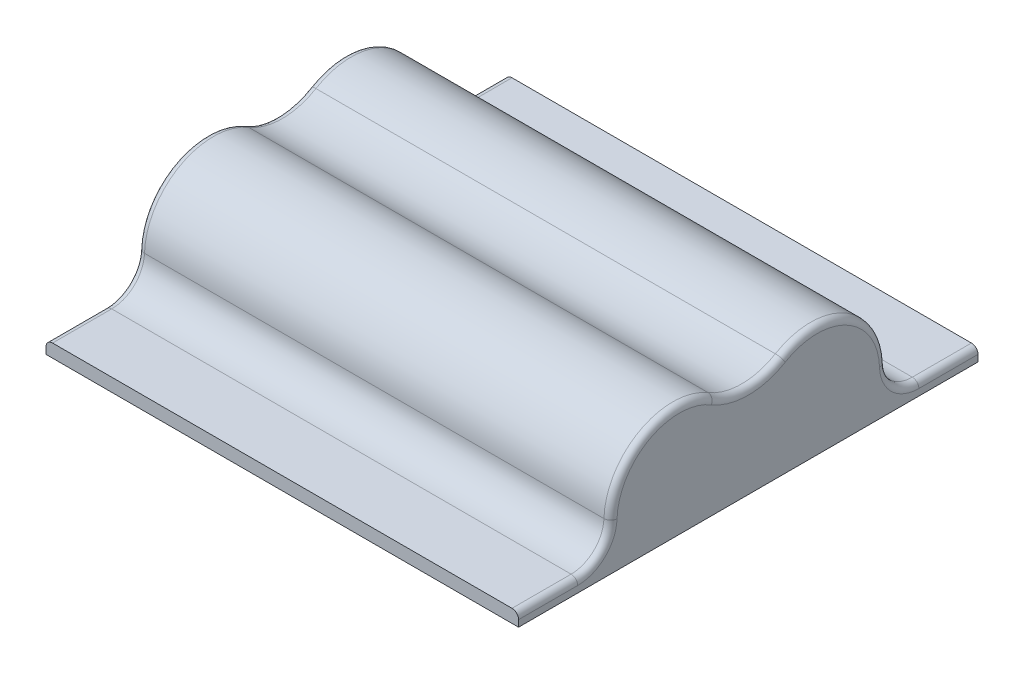
ISO-10303-21;
HEADER;
FILE_DESCRIPTION(('STEP AP214'),'2;1');
FILE_NAME('part.step','',(''),(''),'','','');
FILE_SCHEMA(('AUTOMOTIVE_DESIGN { 1 0 10303 214 1 1 1 1 }'));
ENDSEC;
DATA;
#1=APPLICATION_CONTEXT('core data for automotive mechanical design processes');
#2=APPLICATION_PROTOCOL_DEFINITION('international standard','automotive_design',2000,#1);
#3=PRODUCT_CONTEXT('',#1,'mechanical');
#4=PRODUCT('Part','Part','',(#3));
#5=PRODUCT_RELATED_PRODUCT_CATEGORY('part','',(#4));
#6=PRODUCT_DEFINITION_FORMATION('','',#4);
#7=PRODUCT_DEFINITION_CONTEXT('part definition',#1,'design');
#8=PRODUCT_DEFINITION('design','',#6,#7);
#9=PRODUCT_DEFINITION_SHAPE('','',#8);
#10=(LENGTH_UNIT() NAMED_UNIT(*) SI_UNIT(.MILLI.,.METRE.));
#11=(NAMED_UNIT(*) PLANE_ANGLE_UNIT() SI_UNIT($,.RADIAN.));
#12=(NAMED_UNIT(*) SI_UNIT($,.STERADIAN.) SOLID_ANGLE_UNIT());
#13=UNCERTAINTY_MEASURE_WITH_UNIT(LENGTH_MEASURE(1.E-05),#10,'distance_accuracy_value','');
#14=(GEOMETRIC_REPRESENTATION_CONTEXT(3) GLOBAL_UNCERTAINTY_ASSIGNED_CONTEXT((#13)) GLOBAL_UNIT_ASSIGNED_CONTEXT((#10,
#11,#12)) REPRESENTATION_CONTEXT('',''));
#15=CARTESIAN_POINT('',(0.,0.,0.));
#16=DIRECTION('',(0.,0.,1.));
#17=DIRECTION('',(1.,0.,0.));
#18=AXIS2_PLACEMENT_3D('',#15,#16,#17);
#19=CARTESIAN_POINT('',(0.,2.,0.));
#20=DIRECTION('',(0.,-1.,0.));
#21=DIRECTION('',(0.,0.,-1.));
#22=AXIS2_PLACEMENT_3D('',#19,#20,#21);
#23=PLANE('',#22);
#24=DIRECTION('',(-1.,0.,0.));
#25=VECTOR('',#24,1.);
#26=CARTESIAN_POINT('',(-36.,2.,-35.));
#27=LINE('',#26,#25);
#28=CARTESIAN_POINT('',(35.,2.,-35.));
#29=VERTEX_POINT('',#28);
#30=CARTESIAN_POINT('',(-35.,2.,-35.));
#31=VERTEX_POINT('',#30);
#32=EDGE_CURVE('E270',#29,#31,#27,.T.);
#33=ORIENTED_EDGE('',*,*,#32,.T.);
#34=DIRECTION('',(0.,0.,1.));
#35=VECTOR('',#34,1.);
#36=CARTESIAN_POINT('',(-35.,2.,0.));
#37=LINE('',#36,#35);
#38=CARTESIAN_POINT('',(-35.,2.,-25.9919333848297));
#39=VERTEX_POINT('',#38);
#40=EDGE_CURVE('E332',#31,#39,#37,.T.);
#41=ORIENTED_EDGE('',*,*,#40,.T.);
#42=DIRECTION('',(1.,0.,0.));
#43=VECTOR('',#42,1.);
#44=CARTESIAN_POINT('',(-34.,2.,-25.9919333848297));
#45=LINE('',#44,#43);
#46=CARTESIAN_POINT('',(35.,2.,-25.9919333848297));
#47=VERTEX_POINT('',#46);
#48=EDGE_CURVE('E254',#39,#47,#45,.T.);
#49=ORIENTED_EDGE('',*,*,#48,.T.);
#50=DIRECTION('',(0.,0.,-1.));
#51=VECTOR('',#50,1.);
#52=CARTESIAN_POINT('',(35.,2.,0.));
#53=LINE('',#52,#51);
#54=EDGE_CURVE('E295',#47,#29,#53,.T.);
#55=ORIENTED_EDGE('',*,*,#54,.T.);
#56=EDGE_LOOP('',(#33,#41,#49,#55));
#57=FACE_BOUND('',#56,.T.);
#58=ADVANCED_FACE('F33',(#57),#23,.F.);
#59=DIRECTION('',(1.,0.,0.));
#60=VECTOR('',#59,1.);
#61=CARTESIAN_POINT('',(-34.,2.,25.9919333848297));
#62=LINE('',#61,#60);
#63=CARTESIAN_POINT('',(-35.,2.,25.9919333848297));
#64=VERTEX_POINT('',#63);
#65=CARTESIAN_POINT('',(35.,2.,25.9919333848297));
#66=VERTEX_POINT('',#65);
#67=EDGE_CURVE('E263',#64,#66,#62,.T.);
#68=ORIENTED_EDGE('',*,*,#67,.F.);
#69=DIRECTION('',(0.,0.,1.));
#70=VECTOR('',#69,1.);
#71=CARTESIAN_POINT('',(-35.,2.,0.));
#72=LINE('',#71,#70);
#73=CARTESIAN_POINT('',(-35.,2.,35.));
#74=VERTEX_POINT('',#73);
#75=EDGE_CURVE('E56',#64,#74,#72,.T.);
#76=ORIENTED_EDGE('',*,*,#75,.T.);
#77=DIRECTION('',(1.,0.,0.));
#78=VECTOR('',#77,1.);
#79=CARTESIAN_POINT('',(-36.,2.,35.));
#80=LINE('',#79,#78);
#81=CARTESIAN_POINT('',(35.,2.,35.));
#82=VERTEX_POINT('',#81);
#83=EDGE_CURVE('E268',#74,#82,#80,.T.);
#84=ORIENTED_EDGE('',*,*,#83,.T.);
#85=DIRECTION('',(0.,0.,-1.));
#86=VECTOR('',#85,1.);
#87=CARTESIAN_POINT('',(35.,2.,0.));
#88=LINE('',#87,#86);
#89=EDGE_CURVE('E292',#82,#66,#88,.T.);
#90=ORIENTED_EDGE('',*,*,#89,.T.);
#91=EDGE_LOOP('',(#68,#76,#84,#90));
#92=FACE_BOUND('',#91,.T.);
#93=ADVANCED_FACE('F422',(#92),#23,.F.);
#94=CARTESIAN_POINT('',(0.,0.,0.));
#95=DIRECTION('',(0.,-1.,0.));
#96=DIRECTION('',(0.,0.,-1.));
#97=AXIS2_PLACEMENT_3D('',#94,#95,#96);
#98=PLANE('',#97);
#99=DIRECTION('',(0.,0.,1.));
#100=VECTOR('',#99,1.);
#101=CARTESIAN_POINT('',(-36.,0.,35.));
#102=LINE('',#101,#100);
#103=CARTESIAN_POINT('',(-36.,0.,-35.));
#104=VERTEX_POINT('',#103);
#105=CARTESIAN_POINT('',(-36.,0.,35.));
#106=VERTEX_POINT('',#105);
#107=EDGE_CURVE('E251',#104,#106,#102,.T.);
#108=ORIENTED_EDGE('',*,*,#107,.F.);
#109=DIRECTION('',(-1.,0.,0.));
#110=VECTOR('',#109,1.);
#111=CARTESIAN_POINT('',(-36.,0.,-35.));
#112=LINE('',#111,#110);
#113=CARTESIAN_POINT('',(36.,0.,-35.));
#114=VERTEX_POINT('',#113);
#115=EDGE_CURVE('E271',#114,#104,#112,.T.);
#116=ORIENTED_EDGE('',*,*,#115,.F.);
#117=DIRECTION('',(0.,0.,-1.));
#118=VECTOR('',#117,1.);
#119=CARTESIAN_POINT('',(36.,0.,35.));
#120=LINE('',#119,#118);
#121=CARTESIAN_POINT('',(36.,0.,35.));
#122=VERTEX_POINT('',#121);
#123=EDGE_CURVE('E280',#122,#114,#120,.T.);
#124=ORIENTED_EDGE('',*,*,#123,.F.);
#125=DIRECTION('',(1.,0.,0.));
#126=VECTOR('',#125,1.);
#127=CARTESIAN_POINT('',(-36.,0.,35.));
#128=LINE('',#127,#126);
#129=EDGE_CURVE('E277',#106,#122,#128,.T.);
#130=ORIENTED_EDGE('',*,*,#129,.F.);
#131=EDGE_LOOP('',(#108,#116,#124,#130));
#132=FACE_BOUND('',#131,.T.);
#133=DIRECTION('',(1.,0.,0.));
#134=VECTOR('',#133,1.);
#135=CARTESIAN_POINT('',(-73.5506005011302,0.,-19.75));
#136=LINE('',#135,#134);
#137=CARTESIAN_POINT('',(-34.,0.,-19.75));
#138=VERTEX_POINT('',#137);
#139=CARTESIAN_POINT('',(34.,0.,-19.75));
#140=VERTEX_POINT('',#139);
#141=EDGE_CURVE('E223',#138,#140,#136,.T.);
#142=ORIENTED_EDGE('',*,*,#141,.F.);
#143=DIRECTION('',(0.,0.,1.));
#144=VECTOR('',#143,1.);
#145=CARTESIAN_POINT('',(-34.,0.,-19.75));
#146=LINE('',#145,#144);
#147=CARTESIAN_POINT('',(-34.,0.,19.75));
#148=VERTEX_POINT('',#147);
#149=EDGE_CURVE('E208',#138,#148,#146,.T.);
#150=ORIENTED_EDGE('',*,*,#149,.T.);
#151=DIRECTION('',(1.,0.,0.));
#152=VECTOR('',#151,1.);
#153=CARTESIAN_POINT('',(-73.5506005011302,0.,19.75));
#154=LINE('',#153,#152);
#155=CARTESIAN_POINT('',(34.,0.,19.75));
#156=VERTEX_POINT('',#155);
#157=EDGE_CURVE('E201',#148,#156,#154,.T.);
#158=ORIENTED_EDGE('',*,*,#157,.T.);
#159=DIRECTION('',(0.,0.,-1.));
#160=VECTOR('',#159,1.);
#161=CARTESIAN_POINT('',(34.,0.,-19.75));
#162=LINE('',#161,#160);
#163=EDGE_CURVE('E211',#156,#140,#162,.T.);
#164=ORIENTED_EDGE('',*,*,#163,.T.);
#165=EDGE_LOOP('',(#142,#150,#158,#164));
#166=FACE_BOUND('',#165,.T.);
#167=ADVANCED_FACE('F221',(#132,#166),#98,.T.);
#168=CARTESIAN_POINT('',(-36.,2.,35.));
#169=DIRECTION('',(1.,0.,0.));
#170=DIRECTION('',(0.,0.,-1.));
#171=AXIS2_PLACEMENT_3D('',#168,#169,#170);
#172=PLANE('',#171);
#173=CARTESIAN_POINT('',(-36.,7.,-25.9919333848297));
#174=DIRECTION('',(1.,0.,0.));
#175=DIRECTION('',(0.,0.,-1.));
#176=AXIS2_PLACEMENT_3D('',#173,#174,#175);
#177=CIRCLE('',#176,6.);
#178=CARTESIAN_POINT('',(-36.,6.80645161290323,-19.9950559455408));
#179=VERTEX_POINT('',#178);
#180=CARTESIAN_POINT('',(-36.,0.999999999999999,-25.9919333848297));
#181=VERTEX_POINT('',#180);
#182=EDGE_CURVE('E362',#179,#181,#177,.T.);
#183=ORIENTED_EDGE('',*,*,#182,.T.);
#184=DIRECTION('',(0.,0.,1.));
#185=VECTOR('',#184,1.);
#186=CARTESIAN_POINT('',(-36.,1.,35.));
#187=LINE('',#186,#185);
#188=CARTESIAN_POINT('',(-36.,1.,-35.));
#189=VERTEX_POINT('',#188);
#190=EDGE_CURVE('E364',#181,#189,#187,.F.);
#191=ORIENTED_EDGE('',*,*,#190,.T.);
#192=DIRECTION('',(0.,-1.,0.));
#193=VECTOR('',#192,1.);
#194=CARTESIAN_POINT('',(-36.,2.,-35.));
#195=LINE('',#194,#193);
#196=EDGE_CURVE('E274',#189,#104,#195,.T.);
#197=ORIENTED_EDGE('',*,*,#196,.T.);
#198=ORIENTED_EDGE('',*,*,#107,.T.);
#199=DIRECTION('',(0.,-1.,0.));
#200=VECTOR('',#199,1.);
#201=CARTESIAN_POINT('',(-36.,2.,35.));
#202=LINE('',#201,#200);
#203=CARTESIAN_POINT('',(-36.,1.,35.));
#204=VERTEX_POINT('',#203);
#205=EDGE_CURVE('E290',#204,#106,#202,.T.);
#206=ORIENTED_EDGE('',*,*,#205,.F.);
#207=DIRECTION('',(0.,0.,1.));
#208=VECTOR('',#207,1.);
#209=CARTESIAN_POINT('',(-36.,1.,35.));
#210=LINE('',#209,#208);
#211=CARTESIAN_POINT('',(-36.,0.999999999999999,25.9919333848297));
#212=VERTEX_POINT('',#211);
#213=EDGE_CURVE('E356',#204,#212,#210,.F.);
#214=ORIENTED_EDGE('',*,*,#213,.T.);
#215=CARTESIAN_POINT('',(-36.,7.,25.9919333848297));
#216=DIRECTION('',(1.,0.,0.));
#217=DIRECTION('',(0.,0.,-1.));
#218=AXIS2_PLACEMENT_3D('',#215,#216,#217);
#219=CIRCLE('',#218,6.);
#220=CARTESIAN_POINT('',(-36.,6.80645161290323,19.9950559455408));
#221=VERTEX_POINT('',#220);
#222=EDGE_CURVE('E354',#212,#221,#219,.T.);
#223=ORIENTED_EDGE('',*,*,#222,.T.);
#224=CARTESIAN_POINT('',(-36.,6.5,10.5));
#225=DIRECTION('',(1.,0.,0.));
#226=DIRECTION('',(0.,0.,-1.));
#227=AXIS2_PLACEMENT_3D('',#224,#225,#226);
#228=CIRCLE('',#227,9.5);
#229=CARTESIAN_POINT('',(-36.,14.6592565944273,5.63414634146342));
#230=VERTEX_POINT('',#229);
#231=EDGE_CURVE('E352',#221,#230,#228,.F.);
#232=ORIENTED_EDGE('',*,*,#231,.T.);
#233=CARTESIAN_POINT('',(-36.,24.106816861659,0.));
#234=DIRECTION('',(1.,0.,0.));
#235=DIRECTION('',(0.,0.,-1.));
#236=AXIS2_PLACEMENT_3D('',#233,#234,#235);
#237=CIRCLE('',#236,11.);
#238=CARTESIAN_POINT('',(-36.,14.6592565944273,-5.63414634146342));
#239=VERTEX_POINT('',#238);
#240=EDGE_CURVE('E358',#230,#239,#237,.T.);
#241=ORIENTED_EDGE('',*,*,#240,.T.);
#242=CARTESIAN_POINT('',(-36.,6.5,-10.5));
#243=DIRECTION('',(1.,0.,0.));
#244=DIRECTION('',(0.,0.,-1.));
#245=AXIS2_PLACEMENT_3D('',#242,#243,#244);
#246=CIRCLE('',#245,9.5);
#247=EDGE_CURVE('E360',#239,#179,#246,.F.);
#248=ORIENTED_EDGE('',*,*,#247,.T.);
#249=EDGE_LOOP('',(#183,#191,#197,#198,#206,#214,#223,#232,#241,#248));
#250=FACE_BOUND('',#249,.T.);
#251=ADVANCED_FACE('F407',(#250),#172,.F.);
#252=CARTESIAN_POINT('',(-36.,2.,35.));
#253=DIRECTION('',(0.,0.,-1.));
#254=DIRECTION('',(-1.,0.,0.));
#255=AXIS2_PLACEMENT_3D('',#252,#253,#254);
#256=PLANE('',#255);
#257=ORIENTED_EDGE('',*,*,#83,.F.);
#258=CARTESIAN_POINT('',(-35.,1.,35.));
#259=DIRECTION('',(0.,0.,-1.));
#260=DIRECTION('',(-1.,0.,0.));
#261=AXIS2_PLACEMENT_3D('',#258,#259,#260);
#262=CIRCLE('',#261,1.);
#263=EDGE_CURVE('E375',#74,#204,#262,.F.);
#264=ORIENTED_EDGE('',*,*,#263,.T.);
#265=ORIENTED_EDGE('',*,*,#205,.T.);
#266=ORIENTED_EDGE('',*,*,#129,.T.);
#267=DIRECTION('',(0.,-1.,0.));
#268=VECTOR('',#267,1.);
#269=CARTESIAN_POINT('',(36.,2.,35.));
#270=LINE('',#269,#268);
#271=CARTESIAN_POINT('',(36.,1.,35.));
#272=VERTEX_POINT('',#271);
#273=EDGE_CURVE('E288',#272,#122,#270,.T.);
#274=ORIENTED_EDGE('',*,*,#273,.F.);
#275=CARTESIAN_POINT('',(35.,1.,35.));
#276=DIRECTION('',(0.,0.,-1.));
#277=DIRECTION('',(-1.,0.,0.));
#278=AXIS2_PLACEMENT_3D('',#275,#276,#277);
#279=CIRCLE('',#278,1.);
#280=EDGE_CURVE('E323',#272,#82,#279,.F.);
#281=ORIENTED_EDGE('',*,*,#280,.T.);
#282=EDGE_LOOP('',(#257,#264,#265,#266,#274,#281));
#283=FACE_BOUND('',#282,.T.);
#284=ADVANCED_FACE('F404',(#283),#256,.F.);
#285=CARTESIAN_POINT('',(36.,2.,35.));
#286=DIRECTION('',(-1.,0.,0.));
#287=DIRECTION('',(0.,0.,1.));
#288=AXIS2_PLACEMENT_3D('',#285,#286,#287);
#289=PLANE('',#288);
#290=DIRECTION('',(0.,-1.,0.));
#291=VECTOR('',#290,1.);
#292=CARTESIAN_POINT('',(36.,2.,-35.));
#293=LINE('',#292,#291);
#294=CARTESIAN_POINT('',(36.,1.,-35.));
#295=VERTEX_POINT('',#294);
#296=EDGE_CURVE('E286',#295,#114,#293,.T.);
#297=ORIENTED_EDGE('',*,*,#296,.F.);
#298=DIRECTION('',(0.,0.,-1.));
#299=VECTOR('',#298,1.);
#300=CARTESIAN_POINT('',(36.,1.,35.));
#301=LINE('',#300,#299);
#302=CARTESIAN_POINT('',(36.,0.999999999999999,-25.9919333848297));
#303=VERTEX_POINT('',#302);
#304=EDGE_CURVE('E312',#295,#303,#301,.F.);
#305=ORIENTED_EDGE('',*,*,#304,.T.);
#306=CARTESIAN_POINT('',(36.,7.,-25.9919333848297));
#307=DIRECTION('',(-1.,0.,0.));
#308=DIRECTION('',(0.,0.,1.));
#309=AXIS2_PLACEMENT_3D('',#306,#307,#308);
#310=CIRCLE('',#309,6.);
#311=CARTESIAN_POINT('',(36.,6.80645161290323,-19.9950559455408));
#312=VERTEX_POINT('',#311);
#313=EDGE_CURVE('E310',#303,#312,#310,.T.);
#314=ORIENTED_EDGE('',*,*,#313,.T.);
#315=CARTESIAN_POINT('',(36.,6.5,-10.5));
#316=DIRECTION('',(-1.,0.,0.));
#317=DIRECTION('',(0.,0.,1.));
#318=AXIS2_PLACEMENT_3D('',#315,#316,#317);
#319=CIRCLE('',#318,9.5);
#320=CARTESIAN_POINT('',(36.,14.6592565944273,-5.63414634146342));
#321=VERTEX_POINT('',#320);
#322=EDGE_CURVE('E308',#312,#321,#319,.F.);
#323=ORIENTED_EDGE('',*,*,#322,.T.);
#324=CARTESIAN_POINT('',(36.,24.106816861659,0.));
#325=DIRECTION('',(-1.,0.,0.));
#326=DIRECTION('',(0.,0.,1.));
#327=AXIS2_PLACEMENT_3D('',#324,#325,#326);
#328=CIRCLE('',#327,11.);
#329=CARTESIAN_POINT('',(36.,14.6592565944273,5.63414634146341));
#330=VERTEX_POINT('',#329);
#331=EDGE_CURVE('E306',#321,#330,#328,.T.);
#332=ORIENTED_EDGE('',*,*,#331,.T.);
#333=CARTESIAN_POINT('',(36.,6.5,10.5));
#334=DIRECTION('',(-1.,0.,0.));
#335=DIRECTION('',(0.,0.,1.));
#336=AXIS2_PLACEMENT_3D('',#333,#334,#335);
#337=CIRCLE('',#336,9.5);
#338=CARTESIAN_POINT('',(36.,6.80645161290323,19.9950559455408));
#339=VERTEX_POINT('',#338);
#340=EDGE_CURVE('E300',#330,#339,#337,.F.);
#341=ORIENTED_EDGE('',*,*,#340,.T.);
#342=CARTESIAN_POINT('',(36.,7.,25.9919333848297));
#343=DIRECTION('',(-1.,0.,0.));
#344=DIRECTION('',(0.,0.,1.));
#345=AXIS2_PLACEMENT_3D('',#342,#343,#344);
#346=CIRCLE('',#345,6.);
#347=CARTESIAN_POINT('',(36.,0.999999999999999,25.9919333848297));
#348=VERTEX_POINT('',#347);
#349=EDGE_CURVE('E302',#339,#348,#346,.T.);
#350=ORIENTED_EDGE('',*,*,#349,.T.);
#351=DIRECTION('',(0.,0.,-1.));
#352=VECTOR('',#351,1.);
#353=CARTESIAN_POINT('',(36.,1.,35.));
#354=LINE('',#353,#352);
#355=EDGE_CURVE('E304',#348,#272,#354,.F.);
#356=ORIENTED_EDGE('',*,*,#355,.T.);
#357=ORIENTED_EDGE('',*,*,#273,.T.);
#358=ORIENTED_EDGE('',*,*,#123,.T.);
#359=EDGE_LOOP('',(#297,#305,#314,#323,#332,#341,#350,#356,#357,#358));
#360=FACE_BOUND('',#359,.T.);
#361=ADVANCED_FACE('F476',(#360),#289,.F.);
#362=CARTESIAN_POINT('',(-36.,2.,-35.));
#363=DIRECTION('',(0.,0.,1.));
#364=DIRECTION('',(1.,0.,0.));
#365=AXIS2_PLACEMENT_3D('',#362,#363,#364);
#366=PLANE('',#365);
#367=ORIENTED_EDGE('',*,*,#196,.F.);
#368=CARTESIAN_POINT('',(-35.,1.,-35.));
#369=DIRECTION('',(0.,0.,1.));
#370=DIRECTION('',(1.,0.,0.));
#371=AXIS2_PLACEMENT_3D('',#368,#369,#370);
#372=CIRCLE('',#371,1.);
#373=EDGE_CURVE('E366',#189,#31,#372,.F.);
#374=ORIENTED_EDGE('',*,*,#373,.T.);
#375=ORIENTED_EDGE('',*,*,#32,.F.);
#376=CARTESIAN_POINT('',(35.,1.,-35.));
#377=DIRECTION('',(0.,0.,1.));
#378=DIRECTION('',(1.,0.,0.));
#379=AXIS2_PLACEMENT_3D('',#376,#377,#378);
#380=CIRCLE('',#379,1.);
#381=EDGE_CURVE('E298',#29,#295,#380,.F.);
#382=ORIENTED_EDGE('',*,*,#381,.T.);
#383=ORIENTED_EDGE('',*,*,#296,.T.);
#384=ORIENTED_EDGE('',*,*,#115,.T.);
#385=EDGE_LOOP('',(#367,#374,#375,#382,#383,#384));
#386=FACE_BOUND('',#385,.T.);
#387=ADVANCED_FACE('F473',(#386),#366,.F.);
#388=CARTESIAN_POINT('',(-34.,24.106816861659,0.));
#389=DIRECTION('',(1.,0.,0.));
#390=DIRECTION('',(0.,0.,-1.));
#391=AXIS2_PLACEMENT_3D('',#388,#389,#390);
#392=CYLINDRICAL_SURFACE('',#391,10.);
#393=DIRECTION('',(1.,0.,0.));
#394=VECTOR('',#393,1.);
#395=CARTESIAN_POINT('',(-34.,15.5181257096302,-5.1219512195122));
#396=LINE('',#395,#394);
#397=CARTESIAN_POINT('',(-35.,15.5181257096302,-5.1219512195122));
#398=VERTEX_POINT('',#397);
#399=CARTESIAN_POINT('',(35.,15.5181257096302,-5.1219512195122));
#400=VERTEX_POINT('',#399);
#401=EDGE_CURVE('E249',#398,#400,#396,.T.);
#402=ORIENTED_EDGE('',*,*,#401,.F.);
#403=CARTESIAN_POINT('',(-35.,24.106816861659,0.));
#404=DIRECTION('',(1.,0.,0.));
#405=DIRECTION('',(0.,0.,-1.));
#406=AXIS2_PLACEMENT_3D('',#403,#404,#405);
#407=CIRCLE('',#406,10.);
#408=CARTESIAN_POINT('',(-35.,15.5181257096302,5.1219512195122));
#409=VERTEX_POINT('',#408);
#410=EDGE_CURVE('E372',#398,#409,#407,.F.);
#411=ORIENTED_EDGE('',*,*,#410,.T.);
#412=DIRECTION('',(1.,0.,0.));
#413=VECTOR('',#412,1.);
#414=CARTESIAN_POINT('',(-34.,15.5181257096302,5.1219512195122));
#415=LINE('',#414,#413);
#416=CARTESIAN_POINT('',(35.,15.5181257096302,5.1219512195122));
#417=VERTEX_POINT('',#416);
#418=EDGE_CURVE('E248',#409,#417,#415,.T.);
#419=ORIENTED_EDGE('',*,*,#418,.T.);
#420=CARTESIAN_POINT('',(35.,24.106816861659,0.));
#421=DIRECTION('',(-1.,0.,0.));
#422=DIRECTION('',(0.,0.,1.));
#423=AXIS2_PLACEMENT_3D('',#420,#421,#422);
#424=CIRCLE('',#423,10.);
#425=EDGE_CURVE('E320',#417,#400,#424,.F.);
#426=ORIENTED_EDGE('',*,*,#425,.T.);
#427=EDGE_LOOP('',(#402,#411,#419,#426));
#428=FACE_BOUND('',#427,.T.);
#429=ADVANCED_FACE('F440',(#428),#392,.F.);
#430=CARTESIAN_POINT('',(-34.,6.5,-10.5));
#431=DIRECTION('',(1.,0.,0.));
#432=DIRECTION('',(0.,0.,-1.));
#433=AXIS2_PLACEMENT_3D('',#430,#431,#432);
#434=CYLINDRICAL_SURFACE('',#433,10.5);
#435=DIRECTION('',(1.,0.,0.));
#436=VECTOR('',#435,1.);
#437=CARTESIAN_POINT('',(-34.,6.83870967741936,-20.9945355187556));
#438=LINE('',#437,#436);
#439=CARTESIAN_POINT('',(-35.,6.83870967741936,-20.9945355187556));
#440=VERTEX_POINT('',#439);
#441=CARTESIAN_POINT('',(35.,6.83870967741936,-20.9945355187556));
#442=VERTEX_POINT('',#441);
#443=EDGE_CURVE('E252',#440,#442,#438,.T.);
#444=ORIENTED_EDGE('',*,*,#443,.F.);
#445=CARTESIAN_POINT('',(-35.,6.5,-10.5));
#446=DIRECTION('',(1.,0.,0.));
#447=DIRECTION('',(0.,0.,-1.));
#448=AXIS2_PLACEMENT_3D('',#445,#446,#447);
#449=CIRCLE('',#448,10.5);
#450=EDGE_CURVE('E370',#440,#398,#449,.T.);
#451=ORIENTED_EDGE('',*,*,#450,.T.);
#452=ORIENTED_EDGE('',*,*,#401,.T.);
#453=CARTESIAN_POINT('',(35.,6.5,-10.5));
#454=DIRECTION('',(-1.,0.,0.));
#455=DIRECTION('',(0.,0.,1.));
#456=AXIS2_PLACEMENT_3D('',#453,#454,#455);
#457=CIRCLE('',#456,10.5);
#458=EDGE_CURVE('E317',#400,#442,#457,.T.);
#459=ORIENTED_EDGE('',*,*,#458,.T.);
#460=EDGE_LOOP('',(#444,#451,#452,#459));
#461=FACE_BOUND('',#460,.T.);
#462=ADVANCED_FACE('F600',(#461),#434,.T.);
#463=CARTESIAN_POINT('',(-34.,7.,-25.9919333848297));
#464=DIRECTION('',(1.,0.,0.));
#465=DIRECTION('',(0.,0.,-1.));
#466=AXIS2_PLACEMENT_3D('',#463,#464,#465);
#467=CYLINDRICAL_SURFACE('',#466,5.);
#468=ORIENTED_EDGE('',*,*,#48,.F.);
#469=CARTESIAN_POINT('',(-35.,7.,-25.9919333848297));
#470=DIRECTION('',(1.,0.,0.));
#471=DIRECTION('',(0.,0.,-1.));
#472=AXIS2_PLACEMENT_3D('',#469,#470,#471);
#473=CIRCLE('',#472,5.);
#474=EDGE_CURVE('E368',#39,#440,#473,.F.);
#475=ORIENTED_EDGE('',*,*,#474,.T.);
#476=ORIENTED_EDGE('',*,*,#443,.T.);
#477=CARTESIAN_POINT('',(35.,7.,-25.9919333848297));
#478=DIRECTION('',(-1.,0.,0.));
#479=DIRECTION('',(0.,0.,1.));
#480=AXIS2_PLACEMENT_3D('',#477,#478,#479);
#481=CIRCLE('',#480,5.);
#482=EDGE_CURVE('E314',#442,#47,#481,.F.);
#483=ORIENTED_EDGE('',*,*,#482,.T.);
#484=EDGE_LOOP('',(#468,#475,#476,#483));
#485=FACE_BOUND('',#484,.T.);
#486=ADVANCED_FACE('F593',(#485),#467,.F.);
#487=CARTESIAN_POINT('',(-34.,6.5,-19.75));
#488=DIRECTION('',(0.,0.,1.));
#489=DIRECTION('',(0.,-1.,0.));
#490=AXIS2_PLACEMENT_3D('',#487,#488,#489);
#491=PLANE('',#490);
#492=DIRECTION('',(0.,-1.,0.));
#493=VECTOR('',#492,1.);
#494=CARTESIAN_POINT('',(-34.,6.5,-19.75));
#495=LINE('',#494,#493);
#496=CARTESIAN_POINT('',(-34.,6.5,-19.75));
#497=VERTEX_POINT('',#496);
#498=EDGE_CURVE('E246',#497,#138,#495,.T.);
#499=ORIENTED_EDGE('',*,*,#498,.T.);
#500=ORIENTED_EDGE('',*,*,#141,.T.);
#501=DIRECTION('',(0.,-1.,0.));
#502=VECTOR('',#501,1.);
#503=CARTESIAN_POINT('',(34.,6.5,-19.75));
#504=LINE('',#503,#502);
#505=CARTESIAN_POINT('',(34.,6.5,-19.75));
#506=VERTEX_POINT('',#505);
#507=EDGE_CURVE('E215',#506,#140,#504,.T.);
#508=ORIENTED_EDGE('',*,*,#507,.F.);
#509=DIRECTION('',(1.,0.,0.));
#510=VECTOR('',#509,1.);
#511=CARTESIAN_POINT('',(-34.,6.5,-19.75));
#512=LINE('',#511,#510);
#513=EDGE_CURVE('E256',#497,#506,#512,.T.);
#514=ORIENTED_EDGE('',*,*,#513,.F.);
#515=EDGE_LOOP('',(#499,#500,#508,#514));
#516=FACE_BOUND('',#515,.T.);
#517=ADVANCED_FACE('F599',(#516),#491,.T.);
#518=CARTESIAN_POINT('',(-34.,6.5,-10.5));
#519=DIRECTION('',(1.,0.,0.));
#520=DIRECTION('',(0.,0.,-1.));
#521=AXIS2_PLACEMENT_3D('',#518,#519,#520);
#522=CYLINDRICAL_SURFACE('',#521,9.25);
#523=ORIENTED_EDGE('',*,*,#513,.T.);
#524=CARTESIAN_POINT('',(34.,6.5,-10.5));
#525=DIRECTION('',(-1.,0.,0.));
#526=DIRECTION('',(0.,0.,-1.));
#527=AXIS2_PLACEMENT_3D('',#524,#525,#526);
#528=CIRCLE('',#527,9.25);
#529=CARTESIAN_POINT('',(34.,12.606816861659,-3.55238977646578));
#530=VERTEX_POINT('',#529);
#531=EDGE_CURVE('E232',#530,#506,#528,.T.);
#532=ORIENTED_EDGE('',*,*,#531,.F.);
#533=DIRECTION('',(1.,0.,0.));
#534=VECTOR('',#533,1.);
#535=CARTESIAN_POINT('',(-34.,12.606816861659,-3.55238977646578));
#536=LINE('',#535,#534);
#537=CARTESIAN_POINT('',(-34.,12.606816861659,-3.55238977646578));
#538=VERTEX_POINT('',#537);
#539=EDGE_CURVE('E258',#538,#530,#536,.T.);
#540=ORIENTED_EDGE('',*,*,#539,.F.);
#541=CARTESIAN_POINT('',(-34.,6.5,-10.5));
#542=DIRECTION('',(-1.,0.,0.));
#543=DIRECTION('',(0.,0.,-1.));
#544=AXIS2_PLACEMENT_3D('',#541,#542,#543);
#545=CIRCLE('',#544,9.25);
#546=EDGE_CURVE('E243',#538,#497,#545,.T.);
#547=ORIENTED_EDGE('',*,*,#546,.T.);
#548=EDGE_LOOP('',(#523,#532,#540,#547));
#549=FACE_BOUND('',#548,.T.);
#550=ADVANCED_FACE('F710',(#549),#522,.F.);
#551=CARTESIAN_POINT('',(-34.,12.606816861659,3.55238977646578));
#552=DIRECTION('',(0.,-1.,0.));
#553=DIRECTION('',(0.,0.,-1.));
#554=AXIS2_PLACEMENT_3D('',#551,#552,#553);
#555=PLANE('',#554);
#556=ORIENTED_EDGE('',*,*,#539,.T.);
#557=DIRECTION('',(0.,0.,-1.));
#558=VECTOR('',#557,1.);
#559=CARTESIAN_POINT('',(34.,12.606816861659,3.55238977646578));
#560=LINE('',#559,#558);
#561=CARTESIAN_POINT('',(34.,12.606816861659,3.55238977646578));
#562=VERTEX_POINT('',#561);
#563=EDGE_CURVE('E229',#562,#530,#560,.T.);
#564=ORIENTED_EDGE('',*,*,#563,.F.);
#565=DIRECTION('',(1.,0.,0.));
#566=VECTOR('',#565,1.);
#567=CARTESIAN_POINT('',(-34.,12.606816861659,3.55238977646578));
#568=LINE('',#567,#566);
#569=CARTESIAN_POINT('',(-34.,12.606816861659,3.55238977646578));
#570=VERTEX_POINT('',#569);
#571=EDGE_CURVE('E260',#570,#562,#568,.T.);
#572=ORIENTED_EDGE('',*,*,#571,.F.);
#573=DIRECTION('',(0.,0.,-1.));
#574=VECTOR('',#573,1.);
#575=CARTESIAN_POINT('',(-34.,12.606816861659,3.55238977646578));
#576=LINE('',#575,#574);
#577=EDGE_CURVE('E240',#570,#538,#576,.T.);
#578=ORIENTED_EDGE('',*,*,#577,.T.);
#579=EDGE_LOOP('',(#556,#564,#572,#578));
#580=FACE_BOUND('',#579,.T.);
#581=ADVANCED_FACE('F718',(#580),#555,.T.);
#582=CARTESIAN_POINT('',(-34.,6.5,10.5));
#583=DIRECTION('',(1.,0.,0.));
#584=DIRECTION('',(0.,0.,-1.));
#585=AXIS2_PLACEMENT_3D('',#582,#583,#584);
#586=CYLINDRICAL_SURFACE('',#585,9.25);
#587=ORIENTED_EDGE('',*,*,#571,.T.);
#588=CARTESIAN_POINT('',(34.,6.5,10.5));
#589=DIRECTION('',(-1.,0.,0.));
#590=DIRECTION('',(0.,0.,-1.));
#591=AXIS2_PLACEMENT_3D('',#588,#589,#590);
#592=CIRCLE('',#591,9.25);
#593=CARTESIAN_POINT('',(34.,6.5,19.75));
#594=VERTEX_POINT('',#593);
#595=EDGE_CURVE('E207',#594,#562,#592,.T.);
#596=ORIENTED_EDGE('',*,*,#595,.F.);
#597=DIRECTION('',(1.,0.,0.));
#598=VECTOR('',#597,1.);
#599=CARTESIAN_POINT('',(-34.,6.5,19.75));
#600=LINE('',#599,#598);
#601=CARTESIAN_POINT('',(-34.,6.5,19.75));
#602=VERTEX_POINT('',#601);
#603=EDGE_CURVE('E203',#602,#594,#600,.T.);
#604=ORIENTED_EDGE('',*,*,#603,.F.);
#605=CARTESIAN_POINT('',(-34.,6.5,10.5));
#606=DIRECTION('',(-1.,0.,0.));
#607=DIRECTION('',(0.,0.,-1.));
#608=AXIS2_PLACEMENT_3D('',#605,#606,#607);
#609=CIRCLE('',#608,9.25);
#610=EDGE_CURVE('E237',#602,#570,#609,.T.);
#611=ORIENTED_EDGE('',*,*,#610,.T.);
#612=EDGE_LOOP('',(#587,#596,#604,#611));
#613=FACE_BOUND('',#612,.T.);
#614=ADVANCED_FACE('F726',(#613),#586,.F.);
#615=CARTESIAN_POINT('',(-34.,6.5,19.75));
#616=DIRECTION('',(0.,0.,-1.));
#617=DIRECTION('',(-1.,0.,0.));
#618=AXIS2_PLACEMENT_3D('',#615,#616,#617);
#619=PLANE('',#618);
#620=ORIENTED_EDGE('',*,*,#603,.T.);
#621=DIRECTION('',(0.,1.,0.));
#622=VECTOR('',#621,1.);
#623=CARTESIAN_POINT('',(34.,6.5,19.75));
#624=LINE('',#623,#622);
#625=EDGE_CURVE('E196',#156,#594,#624,.T.);
#626=ORIENTED_EDGE('',*,*,#625,.F.);
#627=ORIENTED_EDGE('',*,*,#157,.F.);
#628=DIRECTION('',(0.,1.,0.));
#629=VECTOR('',#628,1.);
#630=CARTESIAN_POINT('',(-34.,6.5,19.75));
#631=LINE('',#630,#629);
#632=EDGE_CURVE('E235',#148,#602,#631,.T.);
#633=ORIENTED_EDGE('',*,*,#632,.T.);
#634=EDGE_LOOP('',(#620,#626,#627,#633));
#635=FACE_BOUND('',#634,.T.);
#636=ADVANCED_FACE('F198',(#635),#619,.T.);
#637=CARTESIAN_POINT('',(-34.,7.,25.9919333848297));
#638=DIRECTION('',(1.,0.,0.));
#639=DIRECTION('',(0.,0.,-1.));
#640=AXIS2_PLACEMENT_3D('',#637,#638,#639);
#641=CYLINDRICAL_SURFACE('',#640,5.);
#642=DIRECTION('',(1.,0.,0.));
#643=VECTOR('',#642,1.);
#644=CARTESIAN_POINT('',(-34.,6.83870967741936,20.9945355187556));
#645=LINE('',#644,#643);
#646=CARTESIAN_POINT('',(-35.,6.83870967741936,20.9945355187556));
#647=VERTEX_POINT('',#646);
#648=CARTESIAN_POINT('',(35.,6.83870967741936,20.9945355187556));
#649=VERTEX_POINT('',#648);
#650=EDGE_CURVE('E265',#647,#649,#645,.T.);
#651=ORIENTED_EDGE('',*,*,#650,.F.);
#652=CARTESIAN_POINT('',(-35.,7.,25.9919333848297));
#653=DIRECTION('',(1.,0.,0.));
#654=DIRECTION('',(0.,0.,-1.));
#655=AXIS2_PLACEMENT_3D('',#652,#653,#654);
#656=CIRCLE('',#655,5.);
#657=EDGE_CURVE('E42',#647,#64,#656,.F.);
#658=ORIENTED_EDGE('',*,*,#657,.T.);
#659=ORIENTED_EDGE('',*,*,#67,.T.);
#660=CARTESIAN_POINT('',(35.,7.,25.9919333848297));
#661=DIRECTION('',(-1.,0.,0.));
#662=DIRECTION('',(0.,0.,1.));
#663=AXIS2_PLACEMENT_3D('',#660,#661,#662);
#664=CIRCLE('',#663,5.);
#665=EDGE_CURVE('E326',#66,#649,#664,.F.);
#666=ORIENTED_EDGE('',*,*,#665,.T.);
#667=EDGE_LOOP('',(#651,#658,#659,#666));
#668=FACE_BOUND('',#667,.T.);
#669=ADVANCED_FACE('F424',(#668),#641,.F.);
#670=CARTESIAN_POINT('',(-34.,6.5,10.5));
#671=DIRECTION('',(1.,0.,0.));
#672=DIRECTION('',(0.,0.,-1.));
#673=AXIS2_PLACEMENT_3D('',#670,#671,#672);
#674=CYLINDRICAL_SURFACE('',#673,10.5);
#675=ORIENTED_EDGE('',*,*,#418,.F.);
#676=CARTESIAN_POINT('',(-35.,6.5,10.5));
#677=DIRECTION('',(1.,0.,0.));
#678=DIRECTION('',(0.,0.,-1.));
#679=AXIS2_PLACEMENT_3D('',#676,#677,#678);
#680=CIRCLE('',#679,10.5);
#681=EDGE_CURVE('E11',#409,#647,#680,.T.);
#682=ORIENTED_EDGE('',*,*,#681,.T.);
#683=ORIENTED_EDGE('',*,*,#650,.T.);
#684=CARTESIAN_POINT('',(35.,6.5,10.5));
#685=DIRECTION('',(-1.,0.,0.));
#686=DIRECTION('',(0.,0.,1.));
#687=AXIS2_PLACEMENT_3D('',#684,#685,#686);
#688=CIRCLE('',#687,10.5);
#689=EDGE_CURVE('E329',#649,#417,#688,.T.);
#690=ORIENTED_EDGE('',*,*,#689,.T.);
#691=EDGE_LOOP('',(#675,#682,#683,#690));
#692=FACE_BOUND('',#691,.T.);
#693=ADVANCED_FACE('F426',(#692),#674,.T.);
#694=CARTESIAN_POINT('',(-34.,24.106816861659,0.));
#695=DIRECTION('',(1.,0.,0.));
#696=DIRECTION('',(0.,0.,-1.));
#697=AXIS2_PLACEMENT_3D('',#694,#695,#696);
#698=PLANE('',#697);
#699=ORIENTED_EDGE('',*,*,#149,.F.);
#700=ORIENTED_EDGE('',*,*,#498,.F.);
#701=ORIENTED_EDGE('',*,*,#546,.F.);
#702=ORIENTED_EDGE('',*,*,#577,.F.);
#703=ORIENTED_EDGE('',*,*,#610,.F.);
#704=ORIENTED_EDGE('',*,*,#632,.F.);
#705=EDGE_LOOP('',(#699,#700,#701,#702,#703,#704));
#706=FACE_BOUND('',#705,.T.);
#707=ADVANCED_FACE('F556',(#706),#698,.T.);
#708=CARTESIAN_POINT('',(34.,24.106816861659,0.));
#709=DIRECTION('',(1.,0.,0.));
#710=DIRECTION('',(0.,0.,-1.));
#711=AXIS2_PLACEMENT_3D('',#708,#709,#710);
#712=PLANE('',#711);
#713=ORIENTED_EDGE('',*,*,#507,.T.);
#714=ORIENTED_EDGE('',*,*,#163,.F.);
#715=ORIENTED_EDGE('',*,*,#625,.T.);
#716=ORIENTED_EDGE('',*,*,#595,.T.);
#717=ORIENTED_EDGE('',*,*,#563,.T.);
#718=ORIENTED_EDGE('',*,*,#531,.T.);
#719=EDGE_LOOP('',(#713,#714,#715,#716,#717,#718));
#720=FACE_BOUND('',#719,.T.);
#721=ADVANCED_FACE('F212',(#720),#712,.F.);
#722=CARTESIAN_POINT('',(35.,1.,0.));
#723=DIRECTION('',(0.,0.,-1.));
#724=DIRECTION('',(-1.,0.,0.));
#725=AXIS2_PLACEMENT_3D('',#722,#723,#724);
#726=CYLINDRICAL_SURFACE('',#725,1.);
#727=ORIENTED_EDGE('',*,*,#280,.F.);
#728=ORIENTED_EDGE('',*,*,#355,.F.);
#729=CARTESIAN_POINT('',(35.,1.,25.9919333848297));
#730=DIRECTION('',(0.,0.,-1.));
#731=DIRECTION('',(-1.,0.,0.));
#732=AXIS2_PLACEMENT_3D('',#729,#730,#731);
#733=CIRCLE('',#732,1.);
#734=EDGE_CURVE('E219',#66,#348,#733,.T.);
#735=ORIENTED_EDGE('',*,*,#734,.F.);
#736=ORIENTED_EDGE('',*,*,#89,.F.);
#737=EDGE_LOOP('',(#727,#728,#735,#736));
#738=FACE_BOUND('',#737,.T.);
#739=ADVANCED_FACE('F419',(#738),#726,.T.);
#740=CARTESIAN_POINT('',(35.,7.,25.9919333848297));
#741=DIRECTION('',(-1.,0.,0.));
#742=DIRECTION('',(0.,0.,1.));
#743=AXIS2_PLACEMENT_3D('',#740,#741,#742);
#744=TOROIDAL_SURFACE('',#743,6.,1.);
#745=ORIENTED_EDGE('',*,*,#734,.T.);
#746=ORIENTED_EDGE('',*,*,#349,.F.);
#747=CARTESIAN_POINT('',(35.,6.80645161290323,19.9950559455408));
#748=DIRECTION('',(0.,0.999479573214817,-0.0322580645161289));
#749=DIRECTION('',(0.,0.0322580645161289,0.999479573214817));
#750=AXIS2_PLACEMENT_3D('',#747,#748,#749);
#751=CIRCLE('',#750,1.);
#752=EDGE_CURVE('E345',#649,#339,#751,.T.);
#753=ORIENTED_EDGE('',*,*,#752,.F.);
#754=ORIENTED_EDGE('',*,*,#665,.F.);
#755=EDGE_LOOP('',(#745,#746,#753,#754));
#756=FACE_BOUND('',#755,.T.);
#757=ADVANCED_FACE('F500',(#756),#744,.T.);
#758=CARTESIAN_POINT('',(35.,6.5,10.5));
#759=DIRECTION('',(-1.,0.,0.));
#760=DIRECTION('',(0.,0.,1.));
#761=AXIS2_PLACEMENT_3D('',#758,#759,#760);
#762=TOROIDAL_SURFACE('',#761,9.5,1.);
#763=ORIENTED_EDGE('',*,*,#752,.T.);
#764=ORIENTED_EDGE('',*,*,#340,.F.);
#765=CARTESIAN_POINT('',(35.,14.6592565944273,5.63414634146341));
#766=DIRECTION('',(0.,-0.512195121951219,-0.858869115202879));
#767=DIRECTION('',(0.,0.858869115202879,-0.512195121951219));
#768=AXIS2_PLACEMENT_3D('',#765,#766,#767);
#769=CIRCLE('',#768,1.);
#770=EDGE_CURVE('E342',#417,#330,#769,.T.);
#771=ORIENTED_EDGE('',*,*,#770,.F.);
#772=ORIENTED_EDGE('',*,*,#689,.F.);
#773=EDGE_LOOP('',(#763,#764,#771,#772));
#774=FACE_BOUND('',#773,.T.);
#775=ADVANCED_FACE('F432',(#774),#762,.T.);
#776=CARTESIAN_POINT('',(35.,24.106816861659,0.));
#777=DIRECTION('',(-1.,0.,0.));
#778=DIRECTION('',(0.,0.,1.));
#779=AXIS2_PLACEMENT_3D('',#776,#777,#778);
#780=TOROIDAL_SURFACE('',#779,11.,1.);
#781=ORIENTED_EDGE('',*,*,#770,.T.);
#782=ORIENTED_EDGE('',*,*,#331,.F.);
#783=CARTESIAN_POINT('',(35.,14.6592565944273,-5.63414634146342));
#784=DIRECTION('',(0.,0.51219512195122,-0.858869115202878));
#785=DIRECTION('',(0.,0.858869115202878,0.51219512195122));
#786=AXIS2_PLACEMENT_3D('',#783,#784,#785);
#787=CIRCLE('',#786,1.);
#788=EDGE_CURVE('E339',#400,#321,#787,.T.);
#789=ORIENTED_EDGE('',*,*,#788,.F.);
#790=ORIENTED_EDGE('',*,*,#425,.F.);
#791=EDGE_LOOP('',(#781,#782,#789,#790));
#792=FACE_BOUND('',#791,.T.);
#793=ADVANCED_FACE('F436',(#792),#780,.T.);
#794=CARTESIAN_POINT('',(35.,6.5,-10.5));
#795=DIRECTION('',(-1.,0.,0.));
#796=DIRECTION('',(0.,0.,1.));
#797=AXIS2_PLACEMENT_3D('',#794,#795,#796);
#798=TOROIDAL_SURFACE('',#797,9.5,1.);
#799=ORIENTED_EDGE('',*,*,#788,.T.);
#800=ORIENTED_EDGE('',*,*,#322,.F.);
#801=CARTESIAN_POINT('',(35.,6.80645161290323,-19.9950559455408));
#802=DIRECTION('',(0.,-0.999479573214817,-0.0322580645161297));
#803=DIRECTION('',(0.,0.0322580645161297,-0.999479573214817));
#804=AXIS2_PLACEMENT_3D('',#801,#802,#803);
#805=CIRCLE('',#804,1.);
#806=EDGE_CURVE('E336',#442,#312,#805,.T.);
#807=ORIENTED_EDGE('',*,*,#806,.F.);
#808=ORIENTED_EDGE('',*,*,#458,.F.);
#809=EDGE_LOOP('',(#799,#800,#807,#808));
#810=FACE_BOUND('',#809,.T.);
#811=ADVANCED_FACE('F491',(#810),#798,.T.);
#812=CARTESIAN_POINT('',(35.,7.,-25.9919333848297));
#813=DIRECTION('',(-1.,0.,0.));
#814=DIRECTION('',(0.,0.,1.));
#815=AXIS2_PLACEMENT_3D('',#812,#813,#814);
#816=TOROIDAL_SURFACE('',#815,6.,1.);
#817=ORIENTED_EDGE('',*,*,#806,.T.);
#818=ORIENTED_EDGE('',*,*,#313,.F.);
#819=CARTESIAN_POINT('',(35.,0.999999999999999,-25.9919333848297));
#820=DIRECTION('',(0.,0.,-1.));
#821=DIRECTION('',(-1.,0.,0.));
#822=AXIS2_PLACEMENT_3D('',#819,#820,#821);
#823=CIRCLE('',#822,1.);
#824=EDGE_CURVE('E333',#47,#303,#823,.T.);
#825=ORIENTED_EDGE('',*,*,#824,.F.);
#826=ORIENTED_EDGE('',*,*,#482,.F.);
#827=EDGE_LOOP('',(#817,#818,#825,#826));
#828=FACE_BOUND('',#827,.T.);
#829=ADVANCED_FACE('F487',(#828),#816,.T.);
#830=CARTESIAN_POINT('',(35.,1.,0.));
#831=DIRECTION('',(0.,0.,-1.));
#832=DIRECTION('',(-1.,0.,0.));
#833=AXIS2_PLACEMENT_3D('',#830,#831,#832);
#834=CYLINDRICAL_SURFACE('',#833,1.);
#835=ORIENTED_EDGE('',*,*,#824,.T.);
#836=ORIENTED_EDGE('',*,*,#304,.F.);
#837=ORIENTED_EDGE('',*,*,#381,.F.);
#838=ORIENTED_EDGE('',*,*,#54,.F.);
#839=EDGE_LOOP('',(#835,#836,#837,#838));
#840=FACE_BOUND('',#839,.T.);
#841=ADVANCED_FACE('F484',(#840),#834,.T.);
#842=CARTESIAN_POINT('',(-35.,1.,0.));
#843=DIRECTION('',(0.,0.,1.));
#844=DIRECTION('',(1.,0.,0.));
#845=AXIS2_PLACEMENT_3D('',#842,#843,#844);
#846=CYLINDRICAL_SURFACE('',#845,1.);
#847=ORIENTED_EDGE('',*,*,#263,.F.);
#848=ORIENTED_EDGE('',*,*,#75,.F.);
#849=CARTESIAN_POINT('',(-35.,1.,25.9919333848297));
#850=DIRECTION('',(0.,0.,-1.));
#851=DIRECTION('',(-1.,0.,0.));
#852=AXIS2_PLACEMENT_3D('',#849,#850,#851);
#853=CIRCLE('',#852,1.);
#854=EDGE_CURVE('E37',#212,#64,#853,.T.);
#855=ORIENTED_EDGE('',*,*,#854,.F.);
#856=ORIENTED_EDGE('',*,*,#213,.F.);
#857=EDGE_LOOP('',(#847,#848,#855,#856));
#858=FACE_BOUND('',#857,.T.);
#859=ADVANCED_FACE('F35',(#858),#846,.T.);
#860=CARTESIAN_POINT('',(-35.,7.,25.9919333848297));
#861=DIRECTION('',(1.,0.,0.));
#862=DIRECTION('',(0.,0.,-1.));
#863=AXIS2_PLACEMENT_3D('',#860,#861,#862);
#864=TOROIDAL_SURFACE('',#863,6.,1.);
#865=ORIENTED_EDGE('',*,*,#854,.T.);
#866=ORIENTED_EDGE('',*,*,#657,.F.);
#867=CARTESIAN_POINT('',(-35.,6.80645161290323,19.9950559455408));
#868=DIRECTION('',(0.,0.999479573214817,-0.0322580645161288));
#869=DIRECTION('',(0.,0.0322580645161289,0.999479573214817));
#870=AXIS2_PLACEMENT_3D('',#867,#868,#869);
#871=CIRCLE('',#870,1.);
#872=EDGE_CURVE('E388',#221,#647,#871,.T.);
#873=ORIENTED_EDGE('',*,*,#872,.F.);
#874=ORIENTED_EDGE('',*,*,#222,.F.);
#875=EDGE_LOOP('',(#865,#866,#873,#874));
#876=FACE_BOUND('',#875,.T.);
#877=ADVANCED_FACE('F398',(#876),#864,.T.);
#878=CARTESIAN_POINT('',(-35.,6.5,10.5));
#879=DIRECTION('',(1.,0.,0.));
#880=DIRECTION('',(0.,0.,-1.));
#881=AXIS2_PLACEMENT_3D('',#878,#879,#880);
#882=TOROIDAL_SURFACE('',#881,9.5,1.);
#883=ORIENTED_EDGE('',*,*,#872,.T.);
#884=ORIENTED_EDGE('',*,*,#681,.F.);
#885=CARTESIAN_POINT('',(-35.,14.6592565944273,5.63414634146342));
#886=DIRECTION('',(0.,-0.512195121951219,-0.858869115202879));
#887=DIRECTION('',(0.,0.858869115202879,-0.512195121951219));
#888=AXIS2_PLACEMENT_3D('',#885,#886,#887);
#889=CIRCLE('',#888,1.);
#890=EDGE_CURVE('E386',#230,#409,#889,.T.);
#891=ORIENTED_EDGE('',*,*,#890,.F.);
#892=ORIENTED_EDGE('',*,*,#231,.F.);
#893=EDGE_LOOP('',(#883,#884,#891,#892));
#894=FACE_BOUND('',#893,.T.);
#895=ADVANCED_FACE('F454',(#894),#882,.T.);
#896=CARTESIAN_POINT('',(-35.,24.106816861659,0.));
#897=DIRECTION('',(1.,0.,0.));
#898=DIRECTION('',(0.,0.,-1.));
#899=AXIS2_PLACEMENT_3D('',#896,#897,#898);
#900=TOROIDAL_SURFACE('',#899,11.,1.);
#901=ORIENTED_EDGE('',*,*,#890,.T.);
#902=ORIENTED_EDGE('',*,*,#410,.F.);
#903=CARTESIAN_POINT('',(-35.,14.6592565944273,-5.63414634146342));
#904=DIRECTION('',(0.,0.512195121951219,-0.858869115202879));
#905=DIRECTION('',(0.,0.858869115202879,0.512195121951219));
#906=AXIS2_PLACEMENT_3D('',#903,#904,#905);
#907=CIRCLE('',#906,1.);
#908=EDGE_CURVE('E383',#239,#398,#907,.T.);
#909=ORIENTED_EDGE('',*,*,#908,.F.);
#910=ORIENTED_EDGE('',*,*,#240,.F.);
#911=EDGE_LOOP('',(#901,#902,#909,#910));
#912=FACE_BOUND('',#911,.T.);
#913=ADVANCED_FACE('F444',(#912),#900,.T.);
#914=CARTESIAN_POINT('',(-35.,6.5,-10.5));
#915=DIRECTION('',(1.,0.,0.));
#916=DIRECTION('',(0.,0.,-1.));
#917=AXIS2_PLACEMENT_3D('',#914,#915,#916);
#918=TOROIDAL_SURFACE('',#917,9.5,1.);
#919=ORIENTED_EDGE('',*,*,#908,.T.);
#920=ORIENTED_EDGE('',*,*,#450,.F.);
#921=CARTESIAN_POINT('',(-35.,6.80645161290323,-19.9950559455408));
#922=DIRECTION('',(0.,-0.999479573214817,-0.0322580645161288));
#923=DIRECTION('',(0.,0.0322580645161289,-0.999479573214817));
#924=AXIS2_PLACEMENT_3D('',#921,#922,#923);
#925=CIRCLE('',#924,1.);
#926=EDGE_CURVE('E380',#179,#440,#925,.T.);
#927=ORIENTED_EDGE('',*,*,#926,.F.);
#928=ORIENTED_EDGE('',*,*,#247,.F.);
#929=EDGE_LOOP('',(#919,#920,#927,#928));
#930=FACE_BOUND('',#929,.T.);
#931=ADVANCED_FACE('F450',(#930),#918,.T.);
#932=CARTESIAN_POINT('',(-35.,7.,-25.9919333848297));
#933=DIRECTION('',(1.,0.,0.));
#934=DIRECTION('',(0.,0.,-1.));
#935=AXIS2_PLACEMENT_3D('',#932,#933,#934);
#936=TOROIDAL_SURFACE('',#935,6.,1.);
#937=ORIENTED_EDGE('',*,*,#926,.T.);
#938=ORIENTED_EDGE('',*,*,#474,.F.);
#939=CARTESIAN_POINT('',(-35.,0.999999999999999,-25.9919333848297));
#940=DIRECTION('',(0.,0.,-1.));
#941=DIRECTION('',(-1.,0.,0.));
#942=AXIS2_PLACEMENT_3D('',#939,#940,#941);
#943=CIRCLE('',#942,1.);
#944=EDGE_CURVE('E378',#181,#39,#943,.T.);
#945=ORIENTED_EDGE('',*,*,#944,.F.);
#946=ORIENTED_EDGE('',*,*,#182,.F.);
#947=EDGE_LOOP('',(#937,#938,#945,#946));
#948=FACE_BOUND('',#947,.T.);
#949=ADVANCED_FACE('F509',(#948),#936,.T.);
#950=CARTESIAN_POINT('',(-35.,1.,0.));
#951=DIRECTION('',(0.,0.,1.));
#952=DIRECTION('',(1.,0.,0.));
#953=AXIS2_PLACEMENT_3D('',#950,#951,#952);
#954=CYLINDRICAL_SURFACE('',#953,1.);
#955=ORIENTED_EDGE('',*,*,#373,.F.);
#956=ORIENTED_EDGE('',*,*,#190,.F.);
#957=ORIENTED_EDGE('',*,*,#944,.T.);
#958=ORIENTED_EDGE('',*,*,#40,.F.);
#959=EDGE_LOOP('',(#955,#956,#957,#958));
#960=FACE_BOUND('',#959,.T.);
#961=ADVANCED_FACE('F506',(#960),#954,.T.);
#962=CLOSED_SHELL('',(#58,#93,#167,#251,#284,#361,#387,#429,#462,#486,#517,#550,#581,#614,#636,
#669,#693,#707,#721,#739,#757,#775,#793,#811,#829,#841,#859,#877,#895,#913,#931,#949,#961));
#963=MANIFOLD_SOLID_BREP('B2',#962);
#964=ADVANCED_BREP_SHAPE_REPRESENTATION('',(#18,#963),#14);
#965=SHAPE_DEFINITION_REPRESENTATION(#9,#964);
ENDSEC;
END-ISO-10303-21;
